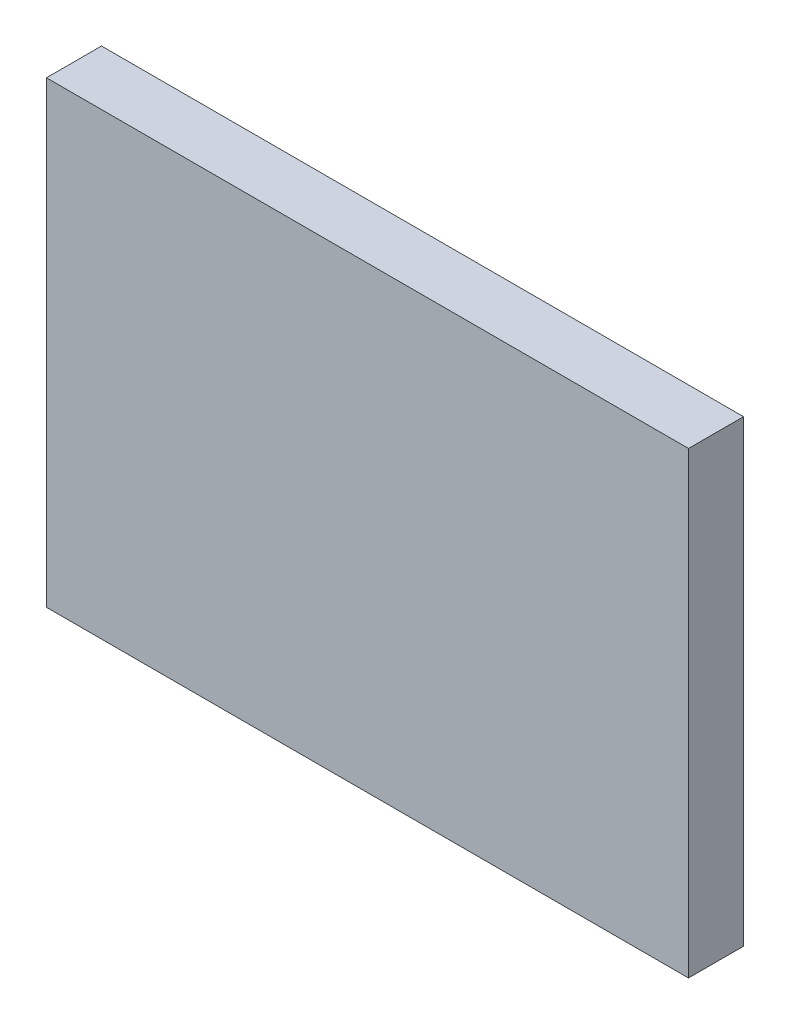
ISO-10303-21;
HEADER;
FILE_DESCRIPTION(('STEP AP214'),'2;1');
FILE_NAME('part.step','',(''),(''),'','','');
FILE_SCHEMA(('AUTOMOTIVE_DESIGN { 1 0 10303 214 1 1 1 1 }'));
ENDSEC;
DATA;
#1=APPLICATION_CONTEXT('core data for automotive mechanical design processes');
#2=APPLICATION_PROTOCOL_DEFINITION('international standard','automotive_design',2000,#1);
#3=PRODUCT_CONTEXT('',#1,'mechanical');
#4=PRODUCT('Part','Part','',(#3));
#5=PRODUCT_RELATED_PRODUCT_CATEGORY('part','',(#4));
#6=PRODUCT_DEFINITION_FORMATION('','',#4);
#7=PRODUCT_DEFINITION_CONTEXT('part definition',#1,'design');
#8=PRODUCT_DEFINITION('design','',#6,#7);
#9=PRODUCT_DEFINITION_SHAPE('','',#8);
#10=(LENGTH_UNIT() NAMED_UNIT(*) SI_UNIT(.MILLI.,.METRE.));
#11=(NAMED_UNIT(*) PLANE_ANGLE_UNIT() SI_UNIT($,.RADIAN.));
#12=(NAMED_UNIT(*) SI_UNIT($,.STERADIAN.) SOLID_ANGLE_UNIT());
#13=UNCERTAINTY_MEASURE_WITH_UNIT(LENGTH_MEASURE(1.E-05),#10,'distance_accuracy_value','');
#14=(GEOMETRIC_REPRESENTATION_CONTEXT(3) GLOBAL_UNCERTAINTY_ASSIGNED_CONTEXT((#13)) GLOBAL_UNIT_ASSIGNED_CONTEXT((#10,
#11,#12)) REPRESENTATION_CONTEXT('',''));
#15=CARTESIAN_POINT('',(0.,0.,0.));
#16=DIRECTION('',(0.,0.,1.));
#17=DIRECTION('',(1.,0.,0.));
#18=AXIS2_PLACEMENT_3D('',#15,#16,#17);
#19=CARTESIAN_POINT('',(17.5,12.5,3.));
#20=DIRECTION('',(-1.,0.,0.));
#21=DIRECTION('',(0.,-1.,0.));
#22=AXIS2_PLACEMENT_3D('',#19,#20,#21);
#23=PLANE('',#22);
#24=DIRECTION('',(0.,1.,0.));
#25=VECTOR('',#24,1.);
#26=CARTESIAN_POINT('',(17.5,12.5,0.));
#27=LINE('',#26,#25);
#28=CARTESIAN_POINT('',(17.5,-12.5,0.));
#29=VERTEX_POINT('',#28);
#30=CARTESIAN_POINT('',(17.5,12.5,0.));
#31=VERTEX_POINT('',#30);
#32=EDGE_CURVE('E96',#29,#31,#27,.T.);
#33=ORIENTED_EDGE('',*,*,#32,.T.);
#34=DIRECTION('',(0.,0.,-1.));
#35=VECTOR('',#34,1.);
#36=CARTESIAN_POINT('',(17.5,12.5,3.));
#37=LINE('',#36,#35);
#38=CARTESIAN_POINT('',(17.5,12.5,3.));
#39=VERTEX_POINT('',#38);
#40=EDGE_CURVE('E11',#39,#31,#37,.T.);
#41=ORIENTED_EDGE('',*,*,#40,.F.);
#42=DIRECTION('',(0.,1.,0.));
#43=VECTOR('',#42,1.);
#44=CARTESIAN_POINT('',(17.5,12.5,3.));
#45=LINE('',#44,#43);
#46=CARTESIAN_POINT('',(17.5,-12.5,3.));
#47=VERTEX_POINT('',#46);
#48=EDGE_CURVE('E84',#47,#39,#45,.T.);
#49=ORIENTED_EDGE('',*,*,#48,.F.);
#50=DIRECTION('',(0.,0.,-1.));
#51=VECTOR('',#50,1.);
#52=CARTESIAN_POINT('',(17.5,-12.5,3.));
#53=LINE('',#52,#51);
#54=EDGE_CURVE('E92',#47,#29,#53,.T.);
#55=ORIENTED_EDGE('',*,*,#54,.T.);
#56=EDGE_LOOP('',(#33,#41,#49,#55));
#57=FACE_BOUND('',#56,.T.);
#58=ADVANCED_FACE('F33',(#57),#23,.F.);
#59=CARTESIAN_POINT('',(-17.5,12.5,3.));
#60=DIRECTION('',(0.,-1.,0.));
#61=DIRECTION('',(0.,0.,-1.));
#62=AXIS2_PLACEMENT_3D('',#59,#60,#61);
#63=PLANE('',#62);
#64=DIRECTION('',(-1.,0.,0.));
#65=VECTOR('',#64,1.);
#66=CARTESIAN_POINT('',(-17.5,12.5,0.));
#67=LINE('',#66,#65);
#68=CARTESIAN_POINT('',(-17.5,12.5,0.));
#69=VERTEX_POINT('',#68);
#70=EDGE_CURVE('E88',#31,#69,#67,.T.);
#71=ORIENTED_EDGE('',*,*,#70,.T.);
#72=DIRECTION('',(0.,0.,-1.));
#73=VECTOR('',#72,1.);
#74=CARTESIAN_POINT('',(-17.5,12.5,3.));
#75=LINE('',#74,#73);
#76=CARTESIAN_POINT('',(-17.5,12.5,3.));
#77=VERTEX_POINT('',#76);
#78=EDGE_CURVE('E41',#77,#69,#75,.T.);
#79=ORIENTED_EDGE('',*,*,#78,.F.);
#80=DIRECTION('',(-1.,0.,0.));
#81=VECTOR('',#80,1.);
#82=CARTESIAN_POINT('',(-17.5,12.5,3.));
#83=LINE('',#82,#81);
#84=EDGE_CURVE('E79',#39,#77,#83,.T.);
#85=ORIENTED_EDGE('',*,*,#84,.F.);
#86=ORIENTED_EDGE('',*,*,#40,.T.);
#87=EDGE_LOOP('',(#71,#79,#85,#86));
#88=FACE_BOUND('',#87,.T.);
#89=ADVANCED_FACE('F87',(#88),#63,.F.);
#90=CARTESIAN_POINT('',(-17.5,12.5,3.));
#91=DIRECTION('',(1.,0.,0.));
#92=DIRECTION('',(0.,0.,-1.));
#93=AXIS2_PLACEMENT_3D('',#90,#91,#92);
#94=PLANE('',#93);
#95=DIRECTION('',(0.,-1.,0.));
#96=VECTOR('',#95,1.);
#97=CARTESIAN_POINT('',(-17.5,12.5,0.));
#98=LINE('',#97,#96);
#99=CARTESIAN_POINT('',(-17.5,-12.5,0.));
#100=VERTEX_POINT('',#99);
#101=EDGE_CURVE('E66',#69,#100,#98,.T.);
#102=ORIENTED_EDGE('',*,*,#101,.T.);
#103=DIRECTION('',(0.,0.,-1.));
#104=VECTOR('',#103,1.);
#105=CARTESIAN_POINT('',(-17.5,-12.5,3.));
#106=LINE('',#105,#104);
#107=CARTESIAN_POINT('',(-17.5,-12.5,3.));
#108=VERTEX_POINT('',#107);
#109=EDGE_CURVE('E89',#108,#100,#106,.T.);
#110=ORIENTED_EDGE('',*,*,#109,.F.);
#111=DIRECTION('',(0.,-1.,0.));
#112=VECTOR('',#111,1.);
#113=CARTESIAN_POINT('',(-17.5,12.5,3.));
#114=LINE('',#113,#112);
#115=EDGE_CURVE('E82',#77,#108,#114,.T.);
#116=ORIENTED_EDGE('',*,*,#115,.F.);
#117=ORIENTED_EDGE('',*,*,#78,.T.);
#118=EDGE_LOOP('',(#102,#110,#116,#117));
#119=FACE_BOUND('',#118,.T.);
#120=ADVANCED_FACE('F90',(#119),#94,.F.);
#121=CARTESIAN_POINT('',(-17.5,-12.5,3.));
#122=DIRECTION('',(0.,1.,0.));
#123=DIRECTION('',(0.,0.,1.));
#124=AXIS2_PLACEMENT_3D('',#121,#122,#123);
#125=PLANE('',#124);
#126=DIRECTION('',(1.,0.,0.));
#127=VECTOR('',#126,1.);
#128=CARTESIAN_POINT('',(-17.5,-12.5,0.));
#129=LINE('',#128,#127);
#130=EDGE_CURVE('E72',#100,#29,#129,.T.);
#131=ORIENTED_EDGE('',*,*,#130,.T.);
#132=ORIENTED_EDGE('',*,*,#54,.F.);
#133=DIRECTION('',(1.,0.,0.));
#134=VECTOR('',#133,1.);
#135=CARTESIAN_POINT('',(-17.5,-12.5,3.));
#136=LINE('',#135,#134);
#137=EDGE_CURVE('E49',#108,#47,#136,.T.);
#138=ORIENTED_EDGE('',*,*,#137,.F.);
#139=ORIENTED_EDGE('',*,*,#109,.T.);
#140=EDGE_LOOP('',(#131,#132,#138,#139));
#141=FACE_BOUND('',#140,.T.);
#142=ADVANCED_FACE('F103',(#141),#125,.F.);
#143=CARTESIAN_POINT('',(0.,0.,3.));
#144=DIRECTION('',(0.,0.,1.));
#145=DIRECTION('',(1.,0.,0.));
#146=AXIS2_PLACEMENT_3D('',#143,#144,#145);
#147=PLANE('',#146);
#148=ORIENTED_EDGE('',*,*,#48,.T.);
#149=ORIENTED_EDGE('',*,*,#84,.T.);
#150=ORIENTED_EDGE('',*,*,#115,.T.);
#151=ORIENTED_EDGE('',*,*,#137,.T.);
#152=EDGE_LOOP('',(#148,#149,#150,#151));
#153=FACE_BOUND('',#152,.T.);
#154=ADVANCED_FACE('F80',(#153),#147,.T.);
#155=CARTESIAN_POINT('',(0.,0.,0.));
#156=DIRECTION('',(0.,0.,1.));
#157=DIRECTION('',(1.,0.,0.));
#158=AXIS2_PLACEMENT_3D('',#155,#156,#157);
#159=PLANE('',#158);
#160=ORIENTED_EDGE('',*,*,#32,.F.);
#161=ORIENTED_EDGE('',*,*,#130,.F.);
#162=ORIENTED_EDGE('',*,*,#101,.F.);
#163=ORIENTED_EDGE('',*,*,#70,.F.);
#164=EDGE_LOOP('',(#160,#161,#162,#163));
#165=FACE_BOUND('',#164,.T.);
#166=ADVANCED_FACE('F106',(#165),#159,.F.);
#167=CLOSED_SHELL('',(#58,#89,#120,#142,#154,#166));
#168=MANIFOLD_SOLID_BREP('B2',#167);
#169=ADVANCED_BREP_SHAPE_REPRESENTATION('',(#18,#168),#14);
#170=SHAPE_DEFINITION_REPRESENTATION(#9,#169);
ENDSEC;
END-ISO-10303-21;
